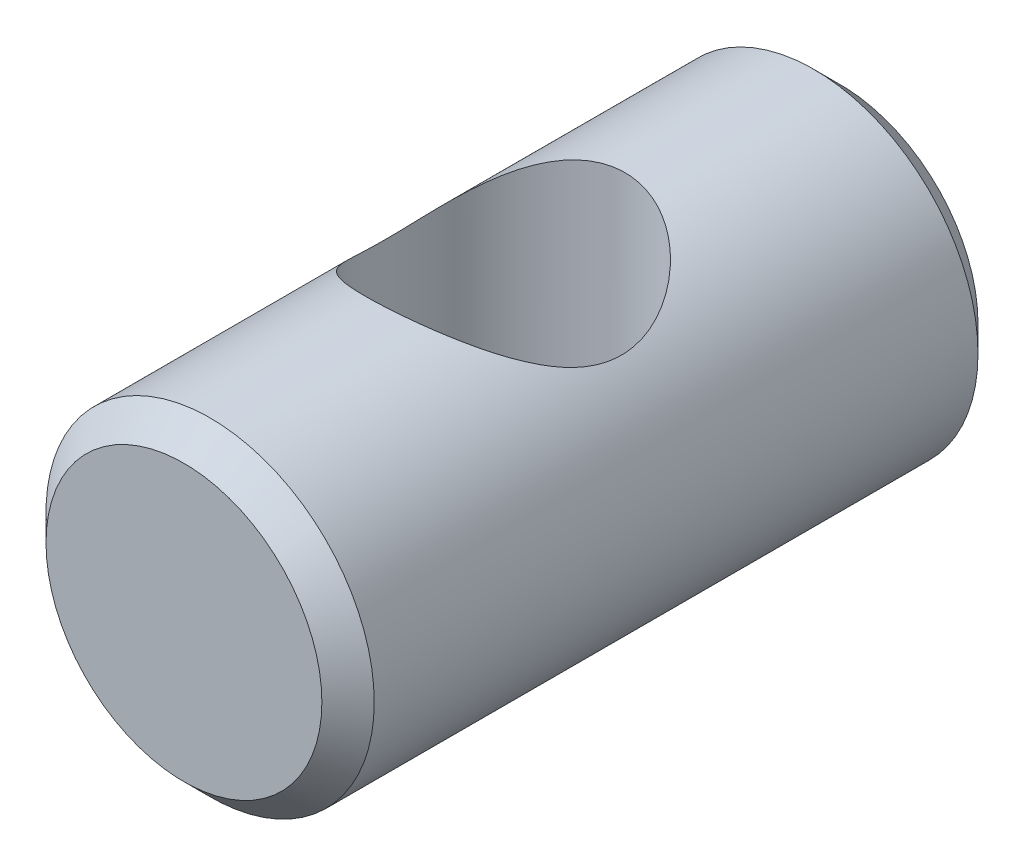
ISO-10303-21;
HEADER;
FILE_DESCRIPTION(('STEP AP214'),'2;1');
FILE_NAME('part.step','',(''),(''),'','','');
FILE_SCHEMA(('AUTOMOTIVE_DESIGN { 1 0 10303 214 1 1 1 1 }'));
ENDSEC;
DATA;
#1=APPLICATION_CONTEXT('core data for automotive mechanical design processes');
#2=APPLICATION_PROTOCOL_DEFINITION('international standard','automotive_design',2000,#1);
#3=PRODUCT_CONTEXT('',#1,'mechanical');
#4=PRODUCT('Part','Part','',(#3));
#5=PRODUCT_RELATED_PRODUCT_CATEGORY('part','',(#4));
#6=PRODUCT_DEFINITION_FORMATION('','',#4);
#7=PRODUCT_DEFINITION_CONTEXT('part definition',#1,'design');
#8=PRODUCT_DEFINITION('design','',#6,#7);
#9=PRODUCT_DEFINITION_SHAPE('','',#8);
#10=(LENGTH_UNIT() NAMED_UNIT(*) SI_UNIT(.MILLI.,.METRE.));
#11=(NAMED_UNIT(*) PLANE_ANGLE_UNIT() SI_UNIT($,.RADIAN.));
#12=(NAMED_UNIT(*) SI_UNIT($,.STERADIAN.) SOLID_ANGLE_UNIT());
#13=UNCERTAINTY_MEASURE_WITH_UNIT(LENGTH_MEASURE(1.E-05),#10,'distance_accuracy_value','');
#14=(GEOMETRIC_REPRESENTATION_CONTEXT(3) GLOBAL_UNCERTAINTY_ASSIGNED_CONTEXT((#13)) GLOBAL_UNIT_ASSIGNED_CONTEXT((#10,
#11,#12)) REPRESENTATION_CONTEXT('',''));
#15=CARTESIAN_POINT('',(0.,0.,0.));
#16=DIRECTION('',(0.,0.,1.));
#17=DIRECTION('',(1.,0.,0.));
#18=AXIS2_PLACEMENT_3D('',#15,#16,#17);
#19=CARTESIAN_POINT('',(0.,0.,9.525));
#20=DIRECTION('',(0.,0.,-1.));
#21=DIRECTION('',(-1.,0.,0.));
#22=AXIS2_PLACEMENT_3D('',#19,#20,#21);
#23=CYLINDRICAL_SURFACE('',#22,4.765);
#24=CARTESIAN_POINT('',(-0.25,-4.75843724346555,3.43));
#25=CARTESIAN_POINT('',(-0.166724112169052,-4.76281167621829,3.42999922787093));
#26=CARTESIAN_POINT('',(-0.0833091871232495,-4.76499730659661,3.42696170981832));
#27=CARTESIAN_POINT('',(0.0831121740296209,-4.7650026918208,3.4148068467804));
#28=CARTESIAN_POINT('',(0.166118334391627,-4.76281982101014,3.40568584755888));
#29=CARTESIAN_POINT('',(0.331186959790397,-4.75419585970188,3.38143299325718));
#30=CARTESIAN_POINT('',(0.413247381645857,-4.74774685395692,3.36628998600944));
#31=CARTESIAN_POINT('',(0.575663796690919,-4.7308054983668,3.33018248201757));
#32=CARTESIAN_POINT('',(0.656019036141792,-4.72031139819935,3.30921546630946));
#33=CARTESIAN_POINT('',(0.892787966377314,-4.68332033908369,3.23819654976144));
#34=CARTESIAN_POINT('',(1.04595137150619,-4.65125389258668,3.17986930590837));
#35=CARTESIAN_POINT('',(1.33984014973707,-4.57527843427846,3.0436190455139));
#36=CARTESIAN_POINT('',(1.48056835886066,-4.53137213201631,2.96570051271122));
#37=CARTESIAN_POINT('',(1.75788689740451,-4.43151908585651,2.78614227044202));
#38=CARTESIAN_POINT('',(1.89336529725831,-4.37491413457117,2.68315702445496));
#39=CARTESIAN_POINT('',(2.14655524443234,-4.25642076403591,2.45967503555253));
#40=CARTESIAN_POINT('',(2.26424375736879,-4.1945256545925,2.33915597919725));
#41=CARTESIAN_POINT('',(2.49954291256701,-4.05942448373215,2.06004986641745));
#42=CARTESIAN_POINT('',(2.61358783923186,-3.98612152048066,1.89848678532065));
#43=CARTESIAN_POINT('',(2.8134167940547,-3.84768475167639,1.55552772477578));
#44=CARTESIAN_POINT('',(2.8992289351292,-3.78254285998121,1.37415171538823));
#45=CARTESIAN_POINT('',(3.02121659224799,-3.68536960684574,1.04249027419633));
#46=CARTESIAN_POINT('',(3.06446847823432,-3.64913089405156,0.896059930245662));
#47=CARTESIAN_POINT('',(3.13130443601069,-3.59195313084763,0.595994145022531));
#48=CARTESIAN_POINT('',(3.15492488386826,-3.57098579230857,0.442372589402985));
#49=CARTESIAN_POINT('',(3.18107400515714,-3.54772325730842,0.130968163534105));
#50=CARTESIAN_POINT('',(3.18348141023251,-3.54553541923722,-0.0268334663617288));
#51=CARTESIAN_POINT('',(3.16668321345997,-3.56054009581889,-0.340378540732282));
#52=CARTESIAN_POINT('',(3.14746550747579,-3.57774346424277,-0.4961207831265));
#53=CARTESIAN_POINT('',(3.0909210961652,-3.62666135115865,-0.789904337023396));
#54=CARTESIAN_POINT('',(3.0549866148247,-3.65725103780534,-0.928415250197684));
#55=CARTESIAN_POINT('',(2.96728528802359,-3.72875878634848,-1.19751261050963));
#56=CARTESIAN_POINT('',(2.91550550146166,-3.76968528568753,-1.3280924753778));
#57=CARTESIAN_POINT('',(2.77052705474689,-3.87825771410624,-1.63782460440973));
#58=CARTESIAN_POINT('',(2.66921327673824,-3.9495685015488,-1.81191316545693));
#59=CARTESIAN_POINT('',(2.4387535532021,-4.09590072272999,-2.13907509935082));
#60=CARTESIAN_POINT('',(2.30955797140353,-4.17092858781236,-2.29211018589258));
#61=CARTESIAN_POINT('',(2.02402160906534,-4.31676779733467,-2.57575490113864));
#62=CARTESIAN_POINT('',(1.86747364912315,-4.38754097750563,-2.70617703034937));
#63=CARTESIAN_POINT('',(1.53024851972964,-4.51618771874562,-2.93894144764791));
#64=CARTESIAN_POINT('',(1.34962456620741,-4.57408899880651,-3.04134418612298));
#65=CARTESIAN_POINT('',(1.01242767734237,-4.65865916827853,-3.19328266988702));
#66=CARTESIAN_POINT('',(0.859923323449721,-4.68945201631652,-3.24956507034397));
#67=CARTESIAN_POINT('',(0.54635690282555,-4.7362191016044,-3.34025251275025));
#68=CARTESIAN_POINT('',(0.385300834260466,-4.75220358398007,-3.37467267483606));
#69=CARTESIAN_POINT('',(0.0585909892563567,-4.76745293508549,-3.42008033355065));
#70=CARTESIAN_POINT('',(-0.107075469726216,-4.76666592499011,-3.43099500658852));
#71=CARTESIAN_POINT('',(-0.437263524427021,-4.74777547003753,-3.42886170148299));
#72=CARTESIAN_POINT('',(-0.601785009912755,-4.72967038048901,-3.41581144729144));
#73=CARTESIAN_POINT('',(-0.917023455984582,-4.67852691536303,-3.36811701365222));
#74=CARTESIAN_POINT('',(-1.06802543846496,-4.64623395849401,-3.33452146005276));
#75=CARTESIAN_POINT('',(-1.36114282577409,-4.56897312306875,-3.2486320258752));
#76=CARTESIAN_POINT('',(-1.5032561767415,-4.52400232821754,-3.19633384236941));
#77=CARTESIAN_POINT('',(-1.78918123830801,-4.41920416422592,-3.06961312822602));
#78=CARTESIAN_POINT('',(-1.93190566387653,-4.35837989651049,-2.99357734594169));
#79=CARTESIAN_POINT('',(-2.20254689954151,-4.22807467175417,-2.82452841204479));
#80=CARTESIAN_POINT('',(-2.3304539546229,-4.15858807365445,-2.73150417873574));
#81=CARTESIAN_POINT('',(-2.59396805594881,-4.00055978130539,-2.51111133608926));
#82=CARTESIAN_POINT('',(-2.72627669731258,-3.9109325153004,-2.38058009592622));
#83=CARTESIAN_POINT('',(-2.96812567159531,-3.73070877587188,-2.100243948315));
#84=CARTESIAN_POINT('',(-3.07764472575725,-3.64011147895989,-1.95042123769023));
#85=CARTESIAN_POINT('',(-3.25959426369705,-3.47751484837525,-1.65330676505373));
#86=CARTESIAN_POINT('',(-3.33502083401562,-3.40464496946819,-1.50833136837071));
#87=CARTESIAN_POINT('',(-3.46586658517558,-3.2713441238456,-1.20430907278381));
#88=CARTESIAN_POINT('',(-3.52132872734755,-3.21088656913652,-1.04529331737332));
#89=CARTESIAN_POINT('',(-3.59765604252707,-3.12482386121801,-0.757665304054353));
#90=CARTESIAN_POINT('',(-3.62377560920146,-3.09423907936361,-0.631975559150282));
#91=CARTESIAN_POINT('',(-3.66180814769204,-3.04914510271433,-0.375721470658429));
#92=CARTESIAN_POINT('',(-3.67374715513707,-3.03460645057289,-0.245166515787295));
#93=CARTESIAN_POINT('',(-3.68248381420053,-3.02400445245463,0.0177966534529437));
#94=CARTESIAN_POINT('',(-3.67921741545453,-3.02801925946825,0.150210360703108));
#95=CARTESIAN_POINT('',(-3.65769938197026,-3.0539665857314,0.412078573372209));
#96=CARTESIAN_POINT('',(-3.63942784679228,-3.07592289956546,0.541528914164661));
#97=CARTESIAN_POINT('',(-3.58281700309049,-3.14180670904453,0.826729712346176));
#98=CARTESIAN_POINT('',(-3.54052764492096,-3.18993005386834,0.980691312065218));
#99=CARTESIAN_POINT('',(-3.43738681858182,-3.30080253377366,1.2767906566915));
#100=CARTESIAN_POINT('',(-3.37648537626474,-3.36359093675505,1.41889524108079));
#101=CARTESIAN_POINT('',(-3.25927230939949,-3.4766169791788,1.64936888169118));
#102=CARTESIAN_POINT('',(-3.20719498221027,-3.52486634365835,1.7409394575126));
#103=CARTESIAN_POINT('',(-3.09541954727663,-3.62341667346676,1.91819495195357));
#104=CARTESIAN_POINT('',(-3.03571875143679,-3.673718358182,2.0038777780348));
#105=CARTESIAN_POINT('',(-2.90891804374965,-3.77491865704642,2.16931406665596));
#106=CARTESIAN_POINT('',(-2.84181267646787,-3.82581768629146,2.24906308395903));
#107=CARTESIAN_POINT('',(-2.70038920437342,-3.92691720618763,2.40236682455076));
#108=CARTESIAN_POINT('',(-2.62607150215374,-3.9771177356504,2.47592189315842));
#109=CARTESIAN_POINT('',(-2.46949972376396,-4.07620796617321,2.61724277483524));
#110=CARTESIAN_POINT('',(-2.38716864979552,-4.1250776725309,2.68493753880603));
#111=CARTESIAN_POINT('',(-2.21541256265412,-4.21980975535666,2.81310096557156));
#112=CARTESIAN_POINT('',(-2.1259865725645,-4.26567171608716,2.87356863036593));
#113=CARTESIAN_POINT('',(-1.94048293416798,-4.35318701528819,2.98645656939565));
#114=CARTESIAN_POINT('',(-1.8444179349447,-4.39484800441004,3.03889156631573));
#115=CARTESIAN_POINT('',(-1.64605779138663,-4.47292957405362,3.1349771488852));
#116=CARTESIAN_POINT('',(-1.54376590080899,-4.50935285855684,3.17863227184576));
#117=CARTESIAN_POINT('',(-1.28981920639204,-4.58975257088417,3.27242101077825));
#118=CARTESIAN_POINT('',(-1.1352862763967,-4.63059676914718,3.31773285408371));
#119=CARTESIAN_POINT('',(-0.89790283907342,-4.68033819384841,3.36922808334745));
#120=CARTESIAN_POINT('',(-0.817919413239363,-4.69498977614935,3.38364210754006));
#121=CARTESIAN_POINT('',(-0.65651498283896,-4.7202607906775,3.4067980569507));
#122=CARTESIAN_POINT('',(-0.575094809436485,-4.7308824790407,3.41554315786432));
#123=CARTESIAN_POINT('',(-0.452884075948464,-4.74360353870642,3.42423436805334));
#124=CARTESIAN_POINT('',(-0.412398045833619,-4.74729478081944,3.42639368476122));
#125=CARTESIAN_POINT('',(-0.331285742741573,-4.75364382663165,3.42927683030824));
#126=CARTESIAN_POINT('',(-0.29065944377002,-4.7563014271186,3.43000037699194));
#127=CARTESIAN_POINT('',(-0.25,-4.75843724346555,3.43));
#128=B_SPLINE_CURVE_WITH_KNOTS('',3,(#24,#25,#26,#27,#28,#29,#30,#31,#32,#33,#34,#35,#36,#37,
#38,#39,#40,#41,#42,#43,#44,#45,#46,#47,#48,#49,#50,#51,#52,#53,#54,#55,#56,#57,#58,#59,#60,#61,
#62,#63,#64,#65,#66,#67,#68,#69,#70,#71,#72,#73,#74,#75,#76,#77,#78,#79,#80,#81,#82,#83,#84,#85,
#86,#87,#88,#89,#90,#91,#92,#93,#94,#95,#96,#97,#98,#99,#100,#101,#102,#103,#104,#105,#106,#107,
#108,#109,#110,#111,#112,#113,#114,#115,#116,#117,#118,#119,#120,#121,#122,#123,#124,#125,#126,
#127),.UNSPECIFIED.,.T.,.F.,(4,2,2,2,2,2,2,2,2,2,2,2,2,2,2,2,2,2,2,2,2,2,2,2,2,2,2,2,2,2,2,2,2,
2,2,2,2,2,2,2,2,2,2,2,2,2,2,2,2,2,2,4),(0.,0.250128749904401,0.500407883064132,
0.751152683255352,1.00200610335284,1.5005745207861,1.99902893760549,2.53506428284883,
3.0717878497701,3.70175770074169,4.33109834451233,4.80006775596797,5.26816624101772,
5.73893897524922,6.20997534433429,6.6473510237769,7.08508487226794,7.72280008470007,
8.36166008801208,9.005587331222,9.64811417987124,10.1423678843309,10.636279384842,
11.1317189102055,11.6272054919413,12.0992981890246,12.5714995707697,13.0879217874425,
13.6046820813895,14.2214259135373,14.8387430440107,15.3739112332421,15.9079208139713,
16.3022952653858,16.6959445170977,17.0912534507832,17.4870875080064,17.9846304730143,
18.483521274847,18.8307287538684,19.1780590008212,19.5256468793742,19.8732153666977,
20.2245350343439,20.5759031603044,20.926619370564,21.2771538674155,21.7730640559323,
22.0205706255639,22.2679384234592,22.3900397673761,22.512165104096),.UNSPECIFIED.);
#129=CARTESIAN_POINT('',(-0.25,-4.75843724346555,3.43));
#130=VERTEX_POINT('',#129);
#131=EDGE_CURVE('E44',#130,#130,#128,.T.);
#132=ORIENTED_EDGE('',*,*,#131,.T.);
#133=EDGE_LOOP('',(#132));
#134=FACE_BOUND('',#133,.T.);
#135=CARTESIAN_POINT('',(-0.25,4.75843724346555,3.43));
#136=CARTESIAN_POINT('',(-0.422180009069406,4.749390618167,3.42999980483541));
#137=CARTESIAN_POINT('',(-0.59386282730199,4.73091871113112,3.41695856293195));
#138=CARTESIAN_POINT('',(-0.930629104770302,4.67635636796384,3.36610979440147));
#139=CARTESIAN_POINT('',(-1.09570851357914,4.64025529237457,3.32828730721862));
#140=CARTESIAN_POINT('',(-1.41392411864396,4.55336447971862,3.23075051942857));
#141=CARTESIAN_POINT('',(-1.56712334101048,4.5026601113221,3.17116292636266));
#142=CARTESIAN_POINT('',(-1.85998836726663,4.38979766700269,3.03299834240104));
#143=CARTESIAN_POINT('',(-1.99965414606241,4.32763956984278,2.95442131629586));
#144=CARTESIAN_POINT('',(-2.27820698899914,4.18828982189439,2.77162910883962));
#145=CARTESIAN_POINT('',(-2.41542819149111,4.11020218068904,2.66557505303866));
#146=CARTESIAN_POINT('',(-2.67111072919315,3.94883137284482,2.43572487373919));
#147=CARTESIAN_POINT('',(-2.78953546002452,3.86553849846079,2.31189500490524));
#148=CARTESIAN_POINT('',(-2.96344629098399,3.732292646302,2.10063521621267));
#149=CARTESIAN_POINT('',(-3.02522112465854,3.68226630299909,2.01833701427756));
#150=CARTESIAN_POINT('',(-3.14150590868554,3.58357003530251,1.84790207991889));
#151=CARTESIAN_POINT('',(-3.1960131207988,3.5349006275963,1.7597631654945));
#152=CARTESIAN_POINT('',(-3.29731229261899,3.44060115304686,1.57784833521895));
#153=CARTESIAN_POINT('',(-3.34411822611588,3.39496567295495,1.48408305992192));
#154=CARTESIAN_POINT('',(-3.42959137880208,3.30859742398812,1.29083456033671));
#155=CARTESIAN_POINT('',(-3.46826509160405,3.2678607546062,1.19135597958454));
#156=CARTESIAN_POINT('',(-3.54347659526858,3.18632211811376,0.96671232869286));
#157=CARTESIAN_POINT('',(-3.57812346664731,3.14705996480953,0.840323998552467));
#158=CARTESIAN_POINT('',(-3.63302442402354,3.08352956814294,0.580976208361931));
#159=CARTESIAN_POINT('',(-3.65331272726122,3.05922569654857,0.448033183521056));
#160=CARTESIAN_POINT('',(-3.67812283683354,3.02936636632518,0.177337549423231));
#161=CARTESIAN_POINT('',(-3.68251233934075,3.02396824643502,0.0395541719109337));
#162=CARTESIAN_POINT('',(-3.67470644643728,3.03344305810687,-0.23487587460697));
#163=CARTESIAN_POINT('',(-3.66249943392474,3.04833018879986,-0.371521679960181));
#164=CARTESIAN_POINT('',(-3.62015799382368,3.09852315491188,-0.65582838063931));
#165=CARTESIAN_POINT('',(-3.58799174144691,3.13612809889826,-0.802759414360213));
#166=CARTESIAN_POINT('',(-3.50660899556505,3.22685391573892,-1.08690765852794));
#167=CARTESIAN_POINT('',(-3.45734815065714,3.28001509196861,-1.22409847190397));
#168=CARTESIAN_POINT('',(-3.35999029035731,3.37921222953507,-1.45031682658415));
#169=CARTESIAN_POINT('',(-3.31552748835515,3.42299124550292,-1.54196683547208));
#170=CARTESIAN_POINT('',(-3.21937168211258,3.51357799533849,-1.7198719105116));
#171=CARTESIAN_POINT('',(-3.16767569861283,3.56038697291962,-1.80612473233373));
#172=CARTESIAN_POINT('',(-3.05733519065029,3.65557723444101,-1.97327341136436));
#173=CARTESIAN_POINT('',(-2.99868376029761,3.70396004583247,-2.05416381804875));
#174=CARTESIAN_POINT('',(-2.87465956601933,3.80102084509467,-2.21043246978884));
#175=CARTESIAN_POINT('',(-2.80928649472037,3.84969884636826,-2.28581046249783));
#176=CARTESIAN_POINT('',(-2.6702557671566,3.94744940552613,-2.43263894546763));
#177=CARTESIAN_POINT('',(-2.59643405525365,3.99650228404323,-2.50394748039488));
#178=CARTESIAN_POINT('',(-2.44198609531555,4.09270177982323,-2.64020867362414));
#179=CARTESIAN_POINT('',(-2.36135999487914,4.13984843840248,-2.70516146972696));
#180=CARTESIAN_POINT('',(-2.19361254846785,4.2311207520192,-2.82808330517596));
#181=CARTESIAN_POINT('',(-2.10650409604225,4.27525208591359,-2.88606563800173));
#182=CARTESIAN_POINT('',(-1.92594548966524,4.3595756679867,-2.99452956360935));
#183=CARTESIAN_POINT('',(-1.8324951446076,4.39976779737237,-3.04501093021117));
#184=CARTESIAN_POINT('',(-1.58991791011193,4.49465680101692,-3.16160717844564));
#185=CARTESIAN_POINT('',(-1.43688887677842,4.54617300319559,-3.22239703143537));
#186=CARTESIAN_POINT('',(-1.11985321098478,4.63445714602499,-3.3220213557935));
#187=CARTESIAN_POINT('',(-0.955854490731874,4.67123558567514,-3.36087146486794));
#188=CARTESIAN_POINT('',(-0.620041304864636,4.72756501903715,-3.41423360193657));
#189=CARTESIAN_POINT('',(-0.448189976813923,4.74702354164412,-3.42861536060857));
#190=CARTESIAN_POINT('',(-0.103195532056558,4.76701209164517,-3.43119218349009));
#191=CARTESIAN_POINT('',(0.0699472713914483,4.76754656888776,-3.41939340455174));
#192=CARTESIAN_POINT('',(0.396800733953035,4.75102741592386,-3.37216085402572));
#193=CARTESIAN_POINT('',(0.550903795546914,4.73547935394817,-3.33884247322146));
#194=CARTESIAN_POINT('',(0.851262679297082,4.69080460019726,-3.25216372524372));
#195=CARTESIAN_POINT('',(0.997516834516372,4.66167503663273,-3.19879911978834));
#196=CARTESIAN_POINT('',(1.28614476637547,4.59066745677348,-3.07104032256261));
#197=CARTESIAN_POINT('',(1.42797966766526,4.5482360225696,-2.99574591149816));
#198=CARTESIAN_POINT('',(1.69771873358212,4.45459184021555,-2.82781924377908));
#199=CARTESIAN_POINT('',(1.8256191613735,4.40337674596603,-2.73518235437366));
#200=CARTESIAN_POINT('',(2.08559098582612,4.28706511495821,-2.51852707855975));
#201=CARTESIAN_POINT('',(2.21504202441681,4.22105957781514,-2.39185853378127));
#202=CARTESIAN_POINT('',(2.4525288591269,4.08765163666693,-2.11988296233599));
#203=CARTESIAN_POINT('',(2.56051870491995,4.02024656957631,-1.97453701758846));
#204=CARTESIAN_POINT('',(2.71141297716131,3.91890470250436,-1.73364032653499));
#205=CARTESIAN_POINT('',(2.76225962831151,3.88310759046258,-1.64375989611526));
#206=CARTESIAN_POINT('',(2.85606768069206,3.81463871939836,-1.45876664530863));
#207=CARTESIAN_POINT('',(2.8990272649147,3.78196768138303,-1.36365262576038));
#208=CARTESIAN_POINT('',(2.97638382467227,3.72139453247151,-1.16888238761678));
#209=CARTESIAN_POINT('',(3.01080676435227,3.6934780438477,-1.06924106056855));
#210=CARTESIAN_POINT('',(3.07061216797024,3.64390866973889,-0.865836413850729));
#211=CARTESIAN_POINT('',(3.09600079900905,3.62225151334222,-0.762075960014789));
#212=CARTESIAN_POINT('',(3.14431905107756,3.58048576732931,-0.514276109849917));
#213=CARTESIAN_POINT('',(3.1632690781055,3.56357947310398,-0.368863877264377));
#214=CARTESIAN_POINT('',(3.18229415057448,3.54660528363274,-0.0759553160984807));
#215=CARTESIAN_POINT('',(3.18238833621043,3.54652031339164,0.0715387471135853));
#216=CARTESIAN_POINT('',(3.16376347579515,3.56313911837428,0.364127843469744));
#217=CARTESIAN_POINT('',(3.14506985693007,3.57982020262542,0.509225849632986));
#218=CARTESIAN_POINT('',(3.09006178812862,3.6274007096972,0.793694678976369));
#219=CARTESIAN_POINT('',(3.05372153995533,3.65832094581285,0.933056792070449));
#220=CARTESIAN_POINT('',(2.94995679839854,3.74283457822027,1.249627259653));
#221=CARTESIAN_POINT('',(2.87616913174531,3.80056128592335,1.42363336901505));
#222=CARTESIAN_POINT('',(2.70309172031867,3.92554694052951,1.75476054116614));
#223=CARTESIAN_POINT('',(2.60375916203549,3.99282180458683,1.91185262262683));
#224=CARTESIAN_POINT('',(2.37965965281677,4.1303821812455,2.21024978907531));
#225=CARTESIAN_POINT('',(2.25446848393284,4.20070005001654,2.35122119961122));
#226=CARTESIAN_POINT('',(1.98132226028617,4.33621841215064,2.61183089931649));
#227=CARTESIAN_POINT('',(1.83339056066265,4.40142405331532,2.73149080683867));
#228=CARTESIAN_POINT('',(1.53413492006617,4.51378899534322,2.93439863762912));
#229=CARTESIAN_POINT('',(1.38501302638156,4.56214832085995,3.02021473285691));
#230=CARTESIAN_POINT('',(1.07249564524744,4.64554146755817,3.16951406225263));
#231=CARTESIAN_POINT('',(0.909111289256101,4.68058556855773,3.23301452201411));
#232=CARTESIAN_POINT('',(0.581478494873656,4.73212589223905,3.33183530764178));
#233=CARTESIAN_POINT('',(0.417802064196768,4.74955942472212,3.36854686433097));
#234=CARTESIAN_POINT('',(0.0859254534274421,4.76711849433294,3.41762518536938));
#235=CARTESIAN_POINT('',(-0.0822731758795953,4.76724989098796,3.43000019011695));
#236=CARTESIAN_POINT('',(-0.25,4.75843724346555,3.43));
#237=B_SPLINE_CURVE_WITH_KNOTS('',3,(#135,#136,#137,#138,#139,#140,#141,#142,#143,#144,#145,
#146,#147,#148,#149,#150,#151,#152,#153,#154,#155,#156,#157,#158,#159,#160,#161,#162,#163,#164,
#165,#166,#167,#168,#169,#170,#171,#172,#173,#174,#175,#176,#177,#178,#179,#180,#181,#182,#183,
#184,#185,#186,#187,#188,#189,#190,#191,#192,#193,#194,#195,#196,#197,#198,#199,#200,#201,#202,
#203,#204,#205,#206,#207,#208,#209,#210,#211,#212,#213,#214,#215,#216,#217,#218,#219,#220,#221,
#222,#223,#224,#225,#226,#227,#228,#229,#230,#231,#232,#233,#234,#235,#236),.UNSPECIFIED.,.T.,
.F.,(4,2,2,2,2,2,2,2,2,2,2,2,2,2,2,2,2,2,2,2,2,2,2,2,2,2,2,2,2,2,2,2,2,2,2,2,2,2,2,2,2,2,2,2,2,
2,2,2,2,2,4),(0.,0.516551025096824,1.03341418220019,1.54731512007828,2.06121701081903,
2.62982932183038,3.19953571462131,3.54246459279583,3.88552231417978,4.22795053195656,
4.57010427222594,4.97905439316964,5.38702665221779,5.79838620186915,6.21003384012951,
6.67262967068467,7.1364347778277,7.46866532411958,7.80103311718076,8.13373371721725,
8.46644953806418,8.80733809568013,9.14821926074384,9.48843965067854,9.82867029735156,
10.3440014803113,10.8589648922706,11.3766614843259,11.8942363430695,12.3673901670618,
12.8406440841658,13.3370245096255,13.8335377244494,14.4096746680997,14.9870321881218,
15.3145391492316,15.6421214663625,15.968694875667,16.2950449261748,16.7357599059526,
17.1760275223247,17.6157000871626,18.0560173690192,18.6457302885718,19.2364380888803,
19.8377403374759,20.4384291081866,20.9723943239786,21.5059464582794,22.0093081125728,
22.5124992983782),.UNSPECIFIED.);
#238=CARTESIAN_POINT('',(-0.25,4.75843724346555,3.43));
#239=VERTEX_POINT('',#238);
#240=EDGE_CURVE('E63',#239,#239,#237,.T.);
#241=ORIENTED_EDGE('',*,*,#240,.T.);
#242=EDGE_LOOP('',(#241));
#243=FACE_BOUND('',#242,.T.);
#244=CARTESIAN_POINT('',(0.,0.,-8.76499999999999));
#245=DIRECTION('',(0.,0.,1.));
#246=DIRECTION('',(1.,0.,0.));
#247=AXIS2_PLACEMENT_3D('',#244,#245,#246);
#248=CIRCLE('',#247,4.765);
#249=CARTESIAN_POINT('',(4.765,0.,-8.76499999999999));
#250=VERTEX_POINT('',#249);
#251=EDGE_CURVE('E54',#250,#250,#248,.T.);
#252=ORIENTED_EDGE('',*,*,#251,.T.);
#253=EDGE_LOOP('',(#252));
#254=FACE_BOUND('',#253,.T.);
#255=CARTESIAN_POINT('',(0.,0.,8.76500000000001));
#256=DIRECTION('',(0.,0.,1.));
#257=DIRECTION('',(1.,0.,0.));
#258=AXIS2_PLACEMENT_3D('',#255,#256,#257);
#259=CIRCLE('',#258,4.765);
#260=CARTESIAN_POINT('',(4.765,0.,8.76500000000001));
#261=VERTEX_POINT('',#260);
#262=EDGE_CURVE('E60',#261,#261,#259,.F.);
#263=ORIENTED_EDGE('',*,*,#262,.T.);
#264=EDGE_LOOP('',(#263));
#265=FACE_BOUND('',#264,.T.);
#266=ADVANCED_FACE('F39',(#134,#243,#254,#265),#23,.T.);
#267=CARTESIAN_POINT('',(0.,0.,9.525));
#268=DIRECTION('',(0.,0.,1.));
#269=DIRECTION('',(1.,0.,0.));
#270=AXIS2_PLACEMENT_3D('',#267,#268,#269);
#271=PLANE('',#270);
#272=CARTESIAN_POINT('',(0.,0.,9.525));
#273=DIRECTION('',(0.,0.,1.));
#274=DIRECTION('',(1.,0.,0.));
#275=AXIS2_PLACEMENT_3D('',#272,#273,#274);
#276=CIRCLE('',#275,4.00500000000001);
#277=CARTESIAN_POINT('',(4.00500000000001,0.,9.525));
#278=VERTEX_POINT('',#277);
#279=EDGE_CURVE('E101',#278,#278,#276,.T.);
#280=ORIENTED_EDGE('',*,*,#279,.T.);
#281=EDGE_LOOP('',(#280));
#282=FACE_BOUND('',#281,.T.);
#283=ADVANCED_FACE('F76',(#282),#271,.T.);
#284=CARTESIAN_POINT('',(0.,0.,-9.525));
#285=DIRECTION('',(0.,0.,1.));
#286=DIRECTION('',(1.,0.,0.));
#287=AXIS2_PLACEMENT_3D('',#284,#285,#286);
#288=PLANE('',#287);
#289=CARTESIAN_POINT('',(0.,0.,-9.525));
#290=DIRECTION('',(0.,0.,1.));
#291=DIRECTION('',(1.,0.,0.));
#292=AXIS2_PLACEMENT_3D('',#289,#290,#291);
#293=CIRCLE('',#292,4.00499999999998);
#294=CARTESIAN_POINT('',(4.00499999999998,0.,-9.525));
#295=VERTEX_POINT('',#294);
#296=EDGE_CURVE('E10',#295,#295,#293,.F.);
#297=ORIENTED_EDGE('',*,*,#296,.T.);
#298=EDGE_LOOP('',(#297));
#299=FACE_BOUND('',#298,.T.);
#300=ADVANCED_FACE('F79',(#299),#288,.F.);
#301=CARTESIAN_POINT('',(0.,0.,9.525));
#302=DIRECTION('',(0.,0.,-1.));
#303=DIRECTION('',(-1.,0.,0.));
#304=AXIS2_PLACEMENT_3D('',#301,#302,#303);
#305=CONICAL_SURFACE('',#304,4.00500000000001,0.785398163397449);
#306=ORIENTED_EDGE('',*,*,#262,.F.);
#307=EDGE_LOOP('',(#306));
#308=FACE_BOUND('',#307,.T.);
#309=ORIENTED_EDGE('',*,*,#279,.F.);
#310=EDGE_LOOP('',(#309));
#311=FACE_BOUND('',#310,.T.);
#312=ADVANCED_FACE('F82',(#308,#311),#305,.T.);
#313=CARTESIAN_POINT('',(0.,0.,-8.76499999999999));
#314=DIRECTION('',(0.,0.,1.));
#315=DIRECTION('',(1.,0.,0.));
#316=AXIS2_PLACEMENT_3D('',#313,#314,#315);
#317=CONICAL_SURFACE('',#316,4.765,0.785398163397451);
#318=ORIENTED_EDGE('',*,*,#296,.F.);
#319=EDGE_LOOP('',(#318));
#320=FACE_BOUND('',#319,.T.);
#321=ORIENTED_EDGE('',*,*,#251,.F.);
#322=EDGE_LOOP('',(#321));
#323=FACE_BOUND('',#322,.T.);
#324=ADVANCED_FACE('F42',(#320,#323),#317,.T.);
#325=CARTESIAN_POINT('',(-0.25,-9.525,0.));
#326=DIRECTION('',(0.,1.,0.));
#327=DIRECTION('',(0.,0.,1.));
#328=AXIS2_PLACEMENT_3D('',#325,#326,#327);
#329=CYLINDRICAL_SURFACE('',#328,3.43);
#330=ORIENTED_EDGE('',*,*,#240,.F.);
#331=EDGE_LOOP('',(#330));
#332=FACE_BOUND('',#331,.T.);
#333=ORIENTED_EDGE('',*,*,#131,.F.);
#334=EDGE_LOOP('',(#333));
#335=FACE_BOUND('',#334,.T.);
#336=ADVANCED_FACE('F71',(#332,#335),#329,.F.);
#337=CLOSED_SHELL('',(#266,#283,#300,#312,#324,#336));
#338=MANIFOLD_SOLID_BREP('B2',#337);
#339=ADVANCED_BREP_SHAPE_REPRESENTATION('',(#18,#338),#14);
#340=SHAPE_DEFINITION_REPRESENTATION(#9,#339);
ENDSEC;
END-ISO-10303-21;
